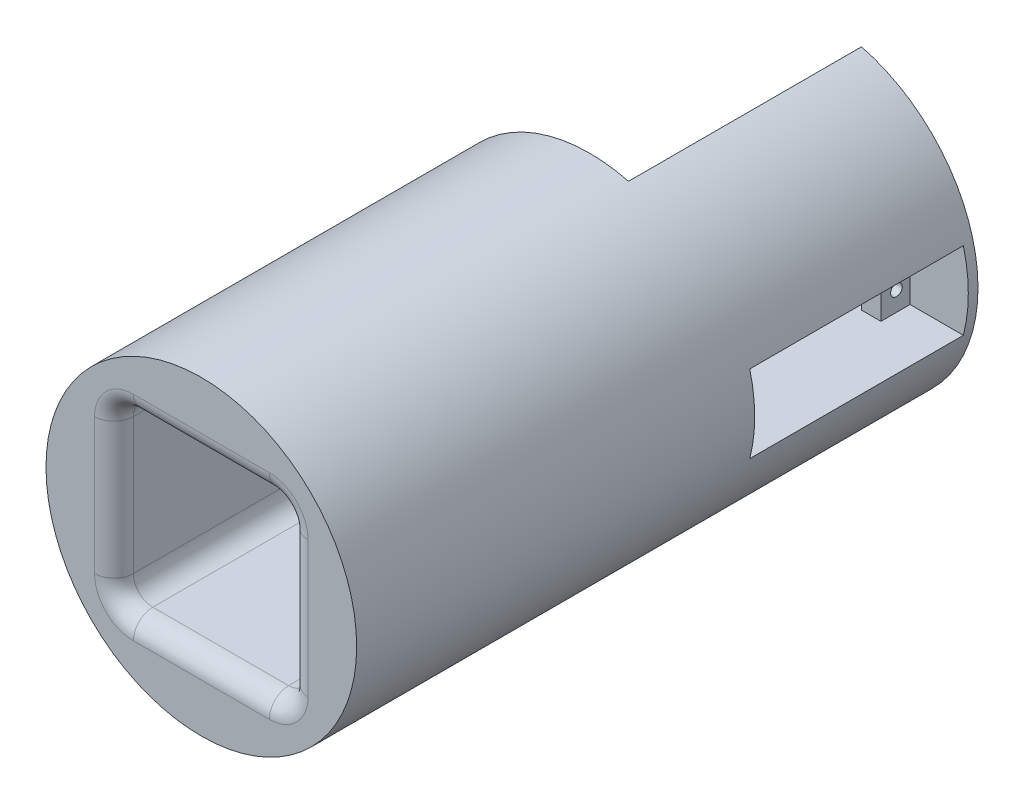
ISO-10303-21;
HEADER;
FILE_DESCRIPTION(('STEP AP214'),'2;1');
FILE_NAME('part.step','',(''),(''),'','','');
FILE_SCHEMA(('AUTOMOTIVE_DESIGN { 1 0 10303 214 1 1 1 1 }'));
ENDSEC;
DATA;
#1=APPLICATION_CONTEXT('core data for automotive mechanical design processes');
#2=APPLICATION_PROTOCOL_DEFINITION('international standard','automotive_design',2000,#1);
#3=PRODUCT_CONTEXT('',#1,'mechanical');
#4=PRODUCT('Part','Part','',(#3));
#5=PRODUCT_RELATED_PRODUCT_CATEGORY('part','',(#4));
#6=PRODUCT_DEFINITION_FORMATION('','',#4);
#7=PRODUCT_DEFINITION_CONTEXT('part definition',#1,'design');
#8=PRODUCT_DEFINITION('design','',#6,#7);
#9=PRODUCT_DEFINITION_SHAPE('','',#8);
#10=(LENGTH_UNIT() NAMED_UNIT(*) SI_UNIT(.MILLI.,.METRE.));
#11=(NAMED_UNIT(*) PLANE_ANGLE_UNIT() SI_UNIT($,.RADIAN.));
#12=(NAMED_UNIT(*) SI_UNIT($,.STERADIAN.) SOLID_ANGLE_UNIT());
#13=UNCERTAINTY_MEASURE_WITH_UNIT(LENGTH_MEASURE(1.E-05),#10,'distance_accuracy_value','');
#14=(GEOMETRIC_REPRESENTATION_CONTEXT(3) GLOBAL_UNCERTAINTY_ASSIGNED_CONTEXT((#13)) GLOBAL_UNIT_ASSIGNED_CONTEXT((#10,
#11,#12)) REPRESENTATION_CONTEXT('',''));
#15=CARTESIAN_POINT('',(0.,0.,0.));
#16=DIRECTION('',(0.,0.,1.));
#17=DIRECTION('',(1.,0.,0.));
#18=AXIS2_PLACEMENT_3D('',#15,#16,#17);
#19=CARTESIAN_POINT('',(49.,0.,-50.));
#20=DIRECTION('',(0.,0.,-1.));
#21=DIRECTION('',(-1.,0.,0.));
#22=AXIS2_PLACEMENT_3D('',#19,#20,#21);
#23=PLANE('',#22);
#24=DIRECTION('',(-1.,0.,0.));
#25=VECTOR('',#24,1.);
#26=CARTESIAN_POINT('',(49.,10.,-50.));
#27=LINE('',#26,#25);
#28=CARTESIAN_POINT('',(25.,10.,-50.));
#29=VERTEX_POINT('',#28);
#30=CARTESIAN_POINT('',(20.,10.,-50.));
#31=VERTEX_POINT('',#30);
#32=EDGE_CURVE('E332',#29,#31,#27,.T.);
#33=ORIENTED_EDGE('',*,*,#32,.F.);
#34=DIRECTION('',(0.,-1.,0.));
#35=VECTOR('',#34,1.);
#36=CARTESIAN_POINT('',(25.,0.,-50.));
#37=LINE('',#36,#35);
#38=CARTESIAN_POINT('',(25.,-9.99999999999999,-50.));
#39=VERTEX_POINT('',#38);
#40=EDGE_CURVE('E312',#29,#39,#37,.T.);
#41=ORIENTED_EDGE('',*,*,#40,.T.);
#42=DIRECTION('',(-1.,0.,0.));
#43=VECTOR('',#42,1.);
#44=CARTESIAN_POINT('',(49.,-9.99999999999999,-50.));
#45=LINE('',#44,#43);
#46=CARTESIAN_POINT('',(20.,-9.99999999999999,-50.));
#47=VERTEX_POINT('',#46);
#48=EDGE_CURVE('E333',#39,#47,#45,.T.);
#49=ORIENTED_EDGE('',*,*,#48,.T.);
#50=DIRECTION('',(0.,-1.,0.));
#51=VECTOR('',#50,1.);
#52=CARTESIAN_POINT('',(20.,0.,-50.));
#53=LINE('',#52,#51);
#54=EDGE_CURVE('E327',#31,#47,#53,.T.);
#55=ORIENTED_EDGE('',*,*,#54,.F.);
#56=EDGE_LOOP('',(#33,#41,#49,#55));
#57=FACE_BOUND('',#56,.T.);
#58=ADVANCED_FACE('F91',(#57),#23,.T.);
#59=CARTESIAN_POINT('',(49.,0.,-90.));
#60=DIRECTION('',(0.,0.,-1.));
#61=DIRECTION('',(-1.,0.,0.));
#62=AXIS2_PLACEMENT_3D('',#59,#60,#61);
#63=PLANE('',#62);
#64=DIRECTION('',(0.,-1.,0.));
#65=VECTOR('',#64,1.);
#66=CARTESIAN_POINT('',(25.,0.,-90.));
#67=LINE('',#66,#65);
#68=CARTESIAN_POINT('',(25.,10.,-90.));
#69=VERTEX_POINT('',#68);
#70=CARTESIAN_POINT('',(25.,-9.99999999999999,-90.));
#71=VERTEX_POINT('',#70);
#72=EDGE_CURVE('E278',#69,#71,#67,.T.);
#73=ORIENTED_EDGE('',*,*,#72,.F.);
#74=DIRECTION('',(-1.,0.,0.));
#75=VECTOR('',#74,1.);
#76=CARTESIAN_POINT('',(49.,10.,-90.));
#77=LINE('',#76,#75);
#78=CARTESIAN_POINT('',(20.,10.,-90.));
#79=VERTEX_POINT('',#78);
#80=EDGE_CURVE('E114',#69,#79,#77,.T.);
#81=ORIENTED_EDGE('',*,*,#80,.T.);
#82=DIRECTION('',(0.,-1.,0.));
#83=VECTOR('',#82,1.);
#84=CARTESIAN_POINT('',(20.,0.,-90.));
#85=LINE('',#84,#83);
#86=CARTESIAN_POINT('',(20.,-9.99999999999999,-90.));
#87=VERTEX_POINT('',#86);
#88=EDGE_CURVE('E330',#79,#87,#85,.T.);
#89=ORIENTED_EDGE('',*,*,#88,.T.);
#90=DIRECTION('',(-1.,0.,0.));
#91=VECTOR('',#90,1.);
#92=CARTESIAN_POINT('',(49.,-9.99999999999999,-90.));
#93=LINE('',#92,#91);
#94=EDGE_CURVE('E336',#71,#87,#93,.T.);
#95=ORIENTED_EDGE('',*,*,#94,.F.);
#96=EDGE_LOOP('',(#73,#81,#89,#95));
#97=FACE_BOUND('',#96,.T.);
#98=ADVANCED_FACE('F517',(#97),#63,.F.);
#99=CARTESIAN_POINT('',(20.,0.,0.));
#100=DIRECTION('',(-1.,0.,0.));
#101=DIRECTION('',(0.,0.,1.));
#102=AXIS2_PLACEMENT_3D('',#99,#100,#101);
#103=PLANE('',#102);
#104=CARTESIAN_POINT('',(20.,-4.99999999999999,-46.));
#105=DIRECTION('',(-1.,0.,0.));
#106=DIRECTION('',(0.,0.,1.));
#107=AXIS2_PLACEMENT_3D('',#104,#105,#106);
#108=CIRCLE('',#107,1.49999999999999);
#109=CARTESIAN_POINT('',(20.,-4.99999999999999,-44.5));
#110=VERTEX_POINT('',#109);
#111=EDGE_CURVE('E321',#110,#110,#108,.T.);
#112=ORIENTED_EDGE('',*,*,#111,.F.);
#113=EDGE_LOOP('',(#112));
#114=FACE_BOUND('',#113,.T.);
#115=CARTESIAN_POINT('',(20.,5.00000000000001,-46.));
#116=DIRECTION('',(-1.,0.,0.));
#117=DIRECTION('',(0.,0.,1.));
#118=AXIS2_PLACEMENT_3D('',#115,#116,#117);
#119=CIRCLE('',#118,1.49999999999999);
#120=CARTESIAN_POINT('',(20.,5.00000000000001,-44.5));
#121=VERTEX_POINT('',#120);
#122=EDGE_CURVE('E324',#121,#121,#119,.T.);
#123=ORIENTED_EDGE('',*,*,#122,.F.);
#124=EDGE_LOOP('',(#123));
#125=FACE_BOUND('',#124,.T.);
#126=DIRECTION('',(0.,0.,-1.));
#127=VECTOR('',#126,1.);
#128=CARTESIAN_POINT('',(20.,10.,-97.5));
#129=LINE('',#128,#127);
#130=CARTESIAN_POINT('',(20.,10.,-42.5));
#131=VERTEX_POINT('',#130);
#132=EDGE_CURVE('E352',#131,#31,#129,.T.);
#133=ORIENTED_EDGE('',*,*,#132,.T.);
#134=ORIENTED_EDGE('',*,*,#54,.T.);
#135=DIRECTION('',(0.,0.,1.));
#136=VECTOR('',#135,1.);
#137=CARTESIAN_POINT('',(20.,-9.99999999999999,-97.5));
#138=LINE('',#137,#136);
#139=CARTESIAN_POINT('',(20.,-9.99999999999999,-42.5));
#140=VERTEX_POINT('',#139);
#141=EDGE_CURVE('E343',#47,#140,#138,.T.);
#142=ORIENTED_EDGE('',*,*,#141,.T.);
#143=DIRECTION('',(0.,1.,0.));
#144=VECTOR('',#143,1.);
#145=CARTESIAN_POINT('',(20.,10.,-42.5));
#146=LINE('',#145,#144);
#147=EDGE_CURVE('E348',#140,#131,#146,.T.);
#148=ORIENTED_EDGE('',*,*,#147,.T.);
#149=EDGE_LOOP('',(#133,#134,#142,#148));
#150=FACE_BOUND('',#149,.T.);
#151=ADVANCED_FACE('F537',(#114,#125,#150),#103,.T.);
#152=CARTESIAN_POINT('',(0.,0.,60.));
#153=DIRECTION('',(0.,0.,-1.));
#154=DIRECTION('',(-1.,0.,0.));
#155=AXIS2_PLACEMENT_3D('',#152,#153,#154);
#156=CYLINDRICAL_SURFACE('',#155,40.);
#157=CARTESIAN_POINT('',(0.,0.,-40.));
#158=DIRECTION('',(0.,0.,-1.));
#159=DIRECTION('',(-1.,0.,0.));
#160=AXIS2_PLACEMENT_3D('',#157,#158,#159);
#161=CIRCLE('',#160,40.);
#162=CARTESIAN_POINT('',(10.,-38.7298334620742,-40.));
#163=VERTEX_POINT('',#162);
#164=CARTESIAN_POINT('',(10.,38.7298334620742,-40.));
#165=VERTEX_POINT('',#164);
#166=EDGE_CURVE('E387',#163,#165,#161,.T.);
#167=ORIENTED_EDGE('',*,*,#166,.F.);
#168=DIRECTION('',(0.,0.,1.));
#169=VECTOR('',#168,1.);
#170=CARTESIAN_POINT('',(10.,-38.7298334620742,-100.));
#171=LINE('',#170,#169);
#172=CARTESIAN_POINT('',(10.,-38.7298334620742,-100.));
#173=VERTEX_POINT('',#172);
#174=EDGE_CURVE('E380',#173,#163,#171,.T.);
#175=ORIENTED_EDGE('',*,*,#174,.F.);
#176=CARTESIAN_POINT('',(0.,0.,-100.));
#177=DIRECTION('',(0.,0.,-1.));
#178=DIRECTION('',(-1.,0.,0.));
#179=AXIS2_PLACEMENT_3D('',#176,#177,#178);
#180=CIRCLE('',#179,40.);
#181=CARTESIAN_POINT('',(10.,38.7298334620742,-100.));
#182=VERTEX_POINT('',#181);
#183=EDGE_CURVE('E377',#182,#173,#180,.T.);
#184=ORIENTED_EDGE('',*,*,#183,.F.);
#185=DIRECTION('',(0.,0.,1.));
#186=VECTOR('',#185,1.);
#187=CARTESIAN_POINT('',(10.,38.7298334620742,-100.));
#188=LINE('',#187,#186);
#189=EDGE_CURVE('E385',#182,#165,#188,.T.);
#190=ORIENTED_EDGE('',*,*,#189,.T.);
#191=EDGE_LOOP('',(#167,#175,#184,#190));
#192=FACE_BOUND('',#191,.T.);
#193=CARTESIAN_POINT('',(0.,0.,60.));
#194=DIRECTION('',(0.,0.,1.));
#195=DIRECTION('',(1.,0.,0.));
#196=AXIS2_PLACEMENT_3D('',#193,#194,#195);
#197=CIRCLE('',#196,40.);
#198=CARTESIAN_POINT('',(40.,0.,60.));
#199=VERTEX_POINT('',#198);
#200=EDGE_CURVE('E391',#199,#199,#197,.T.);
#201=ORIENTED_EDGE('',*,*,#200,.F.);
#202=EDGE_LOOP('',(#201));
#203=FACE_BOUND('',#202,.T.);
#204=DIRECTION('',(0.,0.,-1.));
#205=VECTOR('',#204,1.);
#206=CARTESIAN_POINT('',(38.7298334620742,10.,60.));
#207=LINE('',#206,#205);
#208=CARTESIAN_POINT('',(38.7298334620742,10.,-42.5));
#209=VERTEX_POINT('',#208);
#210=CARTESIAN_POINT('',(38.7298334620742,10.,-97.5));
#211=VERTEX_POINT('',#210);
#212=EDGE_CURVE('E457',#209,#211,#207,.T.);
#213=ORIENTED_EDGE('',*,*,#212,.T.);
#214=CARTESIAN_POINT('',(0.,0.,-97.5));
#215=DIRECTION('',(0.,0.,-1.));
#216=DIRECTION('',(-1.,0.,0.));
#217=AXIS2_PLACEMENT_3D('',#214,#215,#216);
#218=CIRCLE('',#217,40.);
#219=CARTESIAN_POINT('',(38.7298334620742,-9.99999999999998,-97.5));
#220=VERTEX_POINT('',#219);
#221=EDGE_CURVE('E12',#211,#220,#218,.T.);
#222=ORIENTED_EDGE('',*,*,#221,.T.);
#223=DIRECTION('',(0.,0.,-1.));
#224=VECTOR('',#223,1.);
#225=CARTESIAN_POINT('',(38.7298334620742,-9.99999999999999,60.));
#226=LINE('',#225,#224);
#227=CARTESIAN_POINT('',(38.7298334620742,-9.99999999999998,-42.5));
#228=VERTEX_POINT('',#227);
#229=EDGE_CURVE('E267',#220,#228,#226,.F.);
#230=ORIENTED_EDGE('',*,*,#229,.T.);
#231=CARTESIAN_POINT('',(0.,0.,-42.5));
#232=DIRECTION('',(0.,0.,1.));
#233=DIRECTION('',(1.,0.,0.));
#234=AXIS2_PLACEMENT_3D('',#231,#232,#233);
#235=CIRCLE('',#234,40.);
#236=EDGE_CURVE('E99',#228,#209,#235,.T.);
#237=ORIENTED_EDGE('',*,*,#236,.T.);
#238=EDGE_LOOP('',(#213,#222,#230,#237));
#239=FACE_BOUND('',#238,.T.);
#240=ADVANCED_FACE('F499',(#192,#203,#239),#156,.T.);
#241=CARTESIAN_POINT('',(0.,0.,60.));
#242=DIRECTION('',(0.,0.,1.));
#243=DIRECTION('',(1.,0.,0.));
#244=AXIS2_PLACEMENT_3D('',#241,#242,#243);
#245=PLANE('',#244);
#246=ORIENTED_EDGE('',*,*,#200,.T.);
#247=EDGE_LOOP('',(#246));
#248=FACE_BOUND('',#247,.T.);
#249=CARTESIAN_POINT('',(-17.5,17.5,60.));
#250=DIRECTION('',(0.,0.,1.));
#251=DIRECTION('',(1.,0.,0.));
#252=AXIS2_PLACEMENT_3D('',#249,#250,#251);
#253=CIRCLE('',#252,10.);
#254=CARTESIAN_POINT('',(-17.5,27.5,60.));
#255=VERTEX_POINT('',#254);
#256=CARTESIAN_POINT('',(-27.5,17.5,60.));
#257=VERTEX_POINT('',#256);
#258=EDGE_CURVE('E420',#255,#257,#253,.T.);
#259=ORIENTED_EDGE('',*,*,#258,.F.);
#260=DIRECTION('',(1.,0.,0.));
#261=VECTOR('',#260,1.);
#262=CARTESIAN_POINT('',(22.5,27.5,60.));
#263=LINE('',#262,#261);
#264=CARTESIAN_POINT('',(17.5,27.5,60.));
#265=VERTEX_POINT('',#264);
#266=EDGE_CURVE('E417',#255,#265,#263,.T.);
#267=ORIENTED_EDGE('',*,*,#266,.T.);
#268=CARTESIAN_POINT('',(17.5,17.5,60.));
#269=DIRECTION('',(0.,0.,1.));
#270=DIRECTION('',(1.,0.,0.));
#271=AXIS2_PLACEMENT_3D('',#268,#269,#270);
#272=CIRCLE('',#271,10.);
#273=CARTESIAN_POINT('',(27.5,17.5,60.));
#274=VERTEX_POINT('',#273);
#275=EDGE_CURVE('E414',#274,#265,#272,.T.);
#276=ORIENTED_EDGE('',*,*,#275,.F.);
#277=DIRECTION('',(0.,-1.,0.));
#278=VECTOR('',#277,1.);
#279=CARTESIAN_POINT('',(27.5,-22.5,60.));
#280=LINE('',#279,#278);
#281=CARTESIAN_POINT('',(27.5,-17.5,60.));
#282=VERTEX_POINT('',#281);
#283=EDGE_CURVE('E412',#274,#282,#280,.T.);
#284=ORIENTED_EDGE('',*,*,#283,.T.);
#285=CARTESIAN_POINT('',(17.5,-17.5,60.));
#286=DIRECTION('',(0.,0.,1.));
#287=DIRECTION('',(1.,0.,0.));
#288=AXIS2_PLACEMENT_3D('',#285,#286,#287);
#289=CIRCLE('',#288,10.);
#290=CARTESIAN_POINT('',(17.5,-27.5,60.));
#291=VERTEX_POINT('',#290);
#292=EDGE_CURVE('E409',#291,#282,#289,.T.);
#293=ORIENTED_EDGE('',*,*,#292,.F.);
#294=DIRECTION('',(1.,0.,0.));
#295=VECTOR('',#294,1.);
#296=CARTESIAN_POINT('',(0.,-27.5,60.));
#297=LINE('',#296,#295);
#298=CARTESIAN_POINT('',(-17.5,-27.5,60.));
#299=VERTEX_POINT('',#298);
#300=EDGE_CURVE('E405',#291,#299,#297,.F.);
#301=ORIENTED_EDGE('',*,*,#300,.T.);
#302=CARTESIAN_POINT('',(-17.5,-17.5,60.));
#303=DIRECTION('',(0.,0.,1.));
#304=DIRECTION('',(1.,0.,0.));
#305=AXIS2_PLACEMENT_3D('',#302,#303,#304);
#306=CIRCLE('',#305,10.);
#307=CARTESIAN_POINT('',(-27.5,-17.5,60.));
#308=VERTEX_POINT('',#307);
#309=EDGE_CURVE('E394',#308,#299,#306,.T.);
#310=ORIENTED_EDGE('',*,*,#309,.F.);
#311=DIRECTION('',(0.,-1.,0.));
#312=VECTOR('',#311,1.);
#313=CARTESIAN_POINT('',(-27.5,0.,60.));
#314=LINE('',#313,#312);
#315=EDGE_CURVE('E407',#308,#257,#314,.F.);
#316=ORIENTED_EDGE('',*,*,#315,.T.);
#317=EDGE_LOOP('',(#259,#267,#276,#284,#293,#301,#310,#316));
#318=FACE_BOUND('',#317,.T.);
#319=ADVANCED_FACE('F546',(#248,#318),#245,.T.);
#320=CARTESIAN_POINT('',(0.,0.,-40.));
#321=DIRECTION('',(0.,0.,-1.));
#322=DIRECTION('',(-1.,0.,0.));
#323=AXIS2_PLACEMENT_3D('',#320,#321,#322);
#324=PLANE('',#323);
#325=ORIENTED_EDGE('',*,*,#166,.T.);
#326=DIRECTION('',(0.,-1.,0.));
#327=VECTOR('',#326,1.);
#328=CARTESIAN_POINT('',(10.,0.,-40.));
#329=LINE('',#328,#327);
#330=EDGE_CURVE('E378',#165,#163,#329,.T.);
#331=ORIENTED_EDGE('',*,*,#330,.T.);
#332=EDGE_LOOP('',(#325,#331));
#333=FACE_BOUND('',#332,.T.);
#334=ADVANCED_FACE('F815',(#333),#324,.T.);
#335=CARTESIAN_POINT('',(0.,22.5,60.));
#336=DIRECTION('',(0.,1.,0.));
#337=DIRECTION('',(0.,0.,1.));
#338=AXIS2_PLACEMENT_3D('',#335,#336,#337);
#339=PLANE('',#338);
#340=DIRECTION('',(1.,0.,0.));
#341=VECTOR('',#340,1.);
#342=CARTESIAN_POINT('',(-22.5,22.5,55.));
#343=LINE('',#342,#341);
#344=CARTESIAN_POINT('',(17.5,22.5,55.));
#345=VERTEX_POINT('',#344);
#346=CARTESIAN_POINT('',(-17.5,22.5,55.));
#347=VERTEX_POINT('',#346);
#348=EDGE_CURVE('E425',#345,#347,#343,.F.);
#349=ORIENTED_EDGE('',*,*,#348,.T.);
#350=DIRECTION('',(0.,0.,-1.));
#351=VECTOR('',#350,1.);
#352=CARTESIAN_POINT('',(-17.5,22.5,60.));
#353=LINE('',#352,#351);
#354=CARTESIAN_POINT('',(-17.5,22.5,0.));
#355=VERTEX_POINT('',#354);
#356=EDGE_CURVE('E428',#347,#355,#353,.T.);
#357=ORIENTED_EDGE('',*,*,#356,.T.);
#358=DIRECTION('',(1.,0.,0.));
#359=VECTOR('',#358,1.);
#360=CARTESIAN_POINT('',(0.,22.5,0.));
#361=LINE('',#360,#359);
#362=CARTESIAN_POINT('',(17.5,22.5,0.));
#363=VERTEX_POINT('',#362);
#364=EDGE_CURVE('E390',#355,#363,#361,.T.);
#365=ORIENTED_EDGE('',*,*,#364,.T.);
#366=DIRECTION('',(0.,0.,-1.));
#367=VECTOR('',#366,1.);
#368=CARTESIAN_POINT('',(17.5,22.5,60.));
#369=LINE('',#368,#367);
#370=EDGE_CURVE('E423',#363,#345,#369,.F.);
#371=ORIENTED_EDGE('',*,*,#370,.T.);
#372=EDGE_LOOP('',(#349,#357,#365,#371));
#373=FACE_BOUND('',#372,.T.);
#374=ADVANCED_FACE('F842',(#373),#339,.F.);
#375=CARTESIAN_POINT('',(22.5,0.,60.));
#376=DIRECTION('',(1.,0.,0.));
#377=DIRECTION('',(0.,1.,0.));
#378=AXIS2_PLACEMENT_3D('',#375,#376,#377);
#379=PLANE('',#378);
#380=DIRECTION('',(0.,-1.,0.));
#381=VECTOR('',#380,1.);
#382=CARTESIAN_POINT('',(22.5,0.,0.));
#383=LINE('',#382,#381);
#384=CARTESIAN_POINT('',(22.5,17.5,0.));
#385=VERTEX_POINT('',#384);
#386=CARTESIAN_POINT('',(22.5,-17.5,0.));
#387=VERTEX_POINT('',#386);
#388=EDGE_CURVE('E398',#385,#387,#383,.T.);
#389=ORIENTED_EDGE('',*,*,#388,.T.);
#390=DIRECTION('',(0.,0.,-1.));
#391=VECTOR('',#390,1.);
#392=CARTESIAN_POINT('',(22.5,-17.5,60.));
#393=LINE('',#392,#391);
#394=CARTESIAN_POINT('',(22.5,-17.5,55.));
#395=VERTEX_POINT('',#394);
#396=EDGE_CURVE('E434',#387,#395,#393,.F.);
#397=ORIENTED_EDGE('',*,*,#396,.T.);
#398=DIRECTION('',(0.,-1.,0.));
#399=VECTOR('',#398,1.);
#400=CARTESIAN_POINT('',(22.5,22.5,55.));
#401=LINE('',#400,#399);
#402=CARTESIAN_POINT('',(22.5,17.5,55.));
#403=VERTEX_POINT('',#402);
#404=EDGE_CURVE('E432',#395,#403,#401,.F.);
#405=ORIENTED_EDGE('',*,*,#404,.T.);
#406=DIRECTION('',(0.,0.,-1.));
#407=VECTOR('',#406,1.);
#408=CARTESIAN_POINT('',(22.5,17.5,0.));
#409=LINE('',#408,#407);
#410=EDGE_CURVE('E430',#403,#385,#409,.T.);
#411=ORIENTED_EDGE('',*,*,#410,.T.);
#412=EDGE_LOOP('',(#389,#397,#405,#411));
#413=FACE_BOUND('',#412,.T.);
#414=ADVANCED_FACE('F870',(#413),#379,.F.);
#415=CARTESIAN_POINT('',(0.,-22.5,60.));
#416=DIRECTION('',(0.,1.,0.));
#417=DIRECTION('',(0.,0.,1.));
#418=AXIS2_PLACEMENT_3D('',#415,#416,#417);
#419=PLANE('',#418);
#420=DIRECTION('',(1.,0.,0.));
#421=VECTOR('',#420,1.);
#422=CARTESIAN_POINT('',(0.,-22.5,55.));
#423=LINE('',#422,#421);
#424=CARTESIAN_POINT('',(-17.5,-22.5,55.));
#425=VERTEX_POINT('',#424);
#426=CARTESIAN_POINT('',(17.5,-22.5,55.));
#427=VERTEX_POINT('',#426);
#428=EDGE_CURVE('E446',#425,#427,#423,.T.);
#429=ORIENTED_EDGE('',*,*,#428,.T.);
#430=DIRECTION('',(0.,0.,-1.));
#431=VECTOR('',#430,1.);
#432=CARTESIAN_POINT('',(17.5,-22.5,60.));
#433=LINE('',#432,#431);
#434=CARTESIAN_POINT('',(17.5,-22.5,5.));
#435=VERTEX_POINT('',#434);
#436=EDGE_CURVE('E448',#427,#435,#433,.T.);
#437=ORIENTED_EDGE('',*,*,#436,.T.);
#438=DIRECTION('',(1.,0.,0.));
#439=VECTOR('',#438,1.);
#440=CARTESIAN_POINT('',(0.,-22.5,5.));
#441=LINE('',#440,#439);
#442=CARTESIAN_POINT('',(-17.5,-22.5,5.));
#443=VERTEX_POINT('',#442);
#444=EDGE_CURVE('E442',#435,#443,#441,.F.);
#445=ORIENTED_EDGE('',*,*,#444,.T.);
#446=DIRECTION('',(0.,0.,-1.));
#447=VECTOR('',#446,1.);
#448=CARTESIAN_POINT('',(-17.5,-22.5,60.));
#449=LINE('',#448,#447);
#450=EDGE_CURVE('E444',#443,#425,#449,.F.);
#451=ORIENTED_EDGE('',*,*,#450,.T.);
#452=EDGE_LOOP('',(#429,#437,#445,#451));
#453=FACE_BOUND('',#452,.T.);
#454=ADVANCED_FACE('F861',(#453),#419,.T.);
#455=CARTESIAN_POINT('',(-22.5,0.,60.));
#456=DIRECTION('',(1.,0.,0.));
#457=DIRECTION('',(0.,1.,0.));
#458=AXIS2_PLACEMENT_3D('',#455,#456,#457);
#459=PLANE('',#458);
#460=DIRECTION('',(0.,-1.,0.));
#461=VECTOR('',#460,1.);
#462=CARTESIAN_POINT('',(-22.5,0.,55.));
#463=LINE('',#462,#461);
#464=CARTESIAN_POINT('',(-22.5,17.5,55.));
#465=VERTEX_POINT('',#464);
#466=CARTESIAN_POINT('',(-22.5,-17.5,55.));
#467=VERTEX_POINT('',#466);
#468=EDGE_CURVE('E438',#465,#467,#463,.T.);
#469=ORIENTED_EDGE('',*,*,#468,.T.);
#470=DIRECTION('',(0.,0.,-1.));
#471=VECTOR('',#470,1.);
#472=CARTESIAN_POINT('',(-22.5,-17.5,0.));
#473=LINE('',#472,#471);
#474=CARTESIAN_POINT('',(-22.5,-17.5,0.));
#475=VERTEX_POINT('',#474);
#476=EDGE_CURVE('E440',#467,#475,#473,.T.);
#477=ORIENTED_EDGE('',*,*,#476,.T.);
#478=DIRECTION('',(0.,-1.,0.));
#479=VECTOR('',#478,1.);
#480=CARTESIAN_POINT('',(-22.5,0.,0.));
#481=LINE('',#480,#479);
#482=CARTESIAN_POINT('',(-22.5,17.5,0.));
#483=VERTEX_POINT('',#482);
#484=EDGE_CURVE('E395',#483,#475,#481,.T.);
#485=ORIENTED_EDGE('',*,*,#484,.F.);
#486=DIRECTION('',(0.,0.,-1.));
#487=VECTOR('',#486,1.);
#488=CARTESIAN_POINT('',(-22.5,17.5,60.));
#489=LINE('',#488,#487);
#490=EDGE_CURVE('E436',#483,#465,#489,.F.);
#491=ORIENTED_EDGE('',*,*,#490,.T.);
#492=EDGE_LOOP('',(#469,#477,#485,#491));
#493=FACE_BOUND('',#492,.T.);
#494=ADVANCED_FACE('F852',(#493),#459,.T.);
#495=CARTESIAN_POINT('',(0.,0.,0.));
#496=DIRECTION('',(0.,0.,-1.));
#497=DIRECTION('',(-1.,0.,0.));
#498=AXIS2_PLACEMENT_3D('',#495,#496,#497);
#499=PLANE('',#498);
#500=ORIENTED_EDGE('',*,*,#484,.T.);
#501=DIRECTION('',(1.,0.,0.));
#502=VECTOR('',#501,1.);
#503=CARTESIAN_POINT('',(0.,-17.5,0.));
#504=LINE('',#503,#502);
#505=EDGE_CURVE('E455',#475,#387,#504,.T.);
#506=ORIENTED_EDGE('',*,*,#505,.T.);
#507=ORIENTED_EDGE('',*,*,#388,.F.);
#508=CARTESIAN_POINT('',(17.5,17.5,0.));
#509=DIRECTION('',(0.,0.,-1.));
#510=DIRECTION('',(-1.,0.,0.));
#511=AXIS2_PLACEMENT_3D('',#508,#509,#510);
#512=CIRCLE('',#511,5.);
#513=EDGE_CURVE('E451',#385,#363,#512,.F.);
#514=ORIENTED_EDGE('',*,*,#513,.T.);
#515=ORIENTED_EDGE('',*,*,#364,.F.);
#516=CARTESIAN_POINT('',(-17.5,17.5,0.));
#517=DIRECTION('',(0.,0.,-1.));
#518=DIRECTION('',(-1.,0.,0.));
#519=AXIS2_PLACEMENT_3D('',#516,#517,#518);
#520=CIRCLE('',#519,5.);
#521=EDGE_CURVE('E453',#355,#483,#520,.F.);
#522=ORIENTED_EDGE('',*,*,#521,.T.);
#523=EDGE_LOOP('',(#500,#506,#507,#514,#515,#522));
#524=FACE_BOUND('',#523,.T.);
#525=ADVANCED_FACE('F834',(#524),#499,.F.);
#526=CARTESIAN_POINT('',(10.,0.,-100.));
#527=DIRECTION('',(-1.,0.,0.));
#528=DIRECTION('',(0.,0.,1.));
#529=AXIS2_PLACEMENT_3D('',#526,#527,#528);
#530=PLANE('',#529);
#531=DIRECTION('',(0.,-1.,0.));
#532=VECTOR('',#531,1.);
#533=CARTESIAN_POINT('',(10.,10.,-97.5));
#534=LINE('',#533,#532);
#535=CARTESIAN_POINT('',(10.,10.,-97.5));
#536=VERTEX_POINT('',#535);
#537=CARTESIAN_POINT('',(10.,-9.99999999999999,-97.5));
#538=VERTEX_POINT('',#537);
#539=EDGE_CURVE('E335',#536,#538,#534,.T.);
#540=ORIENTED_EDGE('',*,*,#539,.F.);
#541=DIRECTION('',(0.,0.,-1.));
#542=VECTOR('',#541,1.);
#543=CARTESIAN_POINT('',(10.,10.,-97.5));
#544=LINE('',#543,#542);
#545=CARTESIAN_POINT('',(10.,10.,-42.5));
#546=VERTEX_POINT('',#545);
#547=EDGE_CURVE('E344',#546,#536,#544,.T.);
#548=ORIENTED_EDGE('',*,*,#547,.F.);
#549=DIRECTION('',(0.,1.,0.));
#550=VECTOR('',#549,1.);
#551=CARTESIAN_POINT('',(10.,10.,-42.5));
#552=LINE('',#551,#550);
#553=CARTESIAN_POINT('',(10.,-9.99999999999999,-42.5));
#554=VERTEX_POINT('',#553);
#555=EDGE_CURVE('E360',#554,#546,#552,.T.);
#556=ORIENTED_EDGE('',*,*,#555,.F.);
#557=DIRECTION('',(0.,0.,1.));
#558=VECTOR('',#557,1.);
#559=CARTESIAN_POINT('',(10.,-9.99999999999999,-97.5));
#560=LINE('',#559,#558);
#561=EDGE_CURVE('E357',#538,#554,#560,.T.);
#562=ORIENTED_EDGE('',*,*,#561,.F.);
#563=EDGE_LOOP('',(#540,#548,#556,#562));
#564=FACE_BOUND('',#563,.T.);
#565=ORIENTED_EDGE('',*,*,#330,.F.);
#566=ORIENTED_EDGE('',*,*,#189,.F.);
#567=DIRECTION('',(0.,-1.,0.));
#568=VECTOR('',#567,1.);
#569=CARTESIAN_POINT('',(10.,0.,-100.));
#570=LINE('',#569,#568);
#571=EDGE_CURVE('E374',#182,#173,#570,.T.);
#572=ORIENTED_EDGE('',*,*,#571,.T.);
#573=ORIENTED_EDGE('',*,*,#174,.T.);
#574=EDGE_LOOP('',(#565,#566,#572,#573));
#575=FACE_BOUND('',#574,.T.);
#576=ADVANCED_FACE('F529',(#564,#575),#530,.T.);
#577=CARTESIAN_POINT('',(0.,0.,-100.));
#578=DIRECTION('',(0.,0.,-1.));
#579=DIRECTION('',(-1.,0.,0.));
#580=AXIS2_PLACEMENT_3D('',#577,#578,#579);
#581=PLANE('',#580);
#582=ORIENTED_EDGE('',*,*,#571,.F.);
#583=ORIENTED_EDGE('',*,*,#183,.T.);
#584=EDGE_LOOP('',(#582,#583));
#585=FACE_BOUND('',#584,.T.);
#586=ADVANCED_FACE('F807',(#585),#581,.T.);
#587=CARTESIAN_POINT('',(0.,-17.5,5.));
#588=DIRECTION('',(1.,0.,0.));
#589=DIRECTION('',(0.,0.,-1.));
#590=AXIS2_PLACEMENT_3D('',#587,#588,#589);
#591=CYLINDRICAL_SURFACE('',#590,5.);
#592=CARTESIAN_POINT('',(17.5,-17.5,5.));
#593=DIRECTION('',(-0.707106781186547,0.,-0.707106781186547));
#594=DIRECTION('',(0.707106781186547,0.,-0.707106781186547));
#595=AXIS2_PLACEMENT_3D('',#592,#593,#594);
#596=ELLIPSE('',#595,7.07106781186547,5.);
#597=EDGE_CURVE('E491',#387,#435,#596,.T.);
#598=ORIENTED_EDGE('',*,*,#597,.F.);
#599=ORIENTED_EDGE('',*,*,#505,.F.);
#600=CARTESIAN_POINT('',(-17.5,-17.5,5.));
#601=DIRECTION('',(-0.707106781186547,0.,0.707106781186547));
#602=DIRECTION('',(0.707106781186547,0.,0.707106781186547));
#603=AXIS2_PLACEMENT_3D('',#600,#601,#602);
#604=ELLIPSE('',#603,7.07106781186547,5.);
#605=EDGE_CURVE('E383',#443,#475,#604,.F.);
#606=ORIENTED_EDGE('',*,*,#605,.F.);
#607=ORIENTED_EDGE('',*,*,#444,.F.);
#608=EDGE_LOOP('',(#598,#599,#606,#607));
#609=FACE_BOUND('',#608,.T.);
#610=ADVANCED_FACE('F93',(#609),#591,.F.);
#611=CARTESIAN_POINT('',(-17.5,-17.5,60.));
#612=DIRECTION('',(0.,0.,1.));
#613=DIRECTION('',(1.,0.,0.));
#614=AXIS2_PLACEMENT_3D('',#611,#612,#613);
#615=CYLINDRICAL_SURFACE('',#614,5.);
#616=ORIENTED_EDGE('',*,*,#605,.T.);
#617=ORIENTED_EDGE('',*,*,#476,.F.);
#618=CARTESIAN_POINT('',(-17.5,-17.5,55.));
#619=DIRECTION('',(0.,0.,1.));
#620=DIRECTION('',(1.,0.,0.));
#621=AXIS2_PLACEMENT_3D('',#618,#619,#620);
#622=CIRCLE('',#621,5.);
#623=EDGE_CURVE('E488',#425,#467,#622,.F.);
#624=ORIENTED_EDGE('',*,*,#623,.F.);
#625=ORIENTED_EDGE('',*,*,#450,.F.);
#626=EDGE_LOOP('',(#616,#617,#624,#625));
#627=FACE_BOUND('',#626,.T.);
#628=ADVANCED_FACE('F791',(#627),#615,.F.);
#629=CARTESIAN_POINT('',(0.,-27.5,55.));
#630=DIRECTION('',(1.,0.,0.));
#631=DIRECTION('',(0.,0.,-1.));
#632=AXIS2_PLACEMENT_3D('',#629,#630,#631);
#633=CYLINDRICAL_SURFACE('',#632,5.);
#634=CARTESIAN_POINT('',(17.5,-27.5,55.));
#635=DIRECTION('',(1.,0.,0.));
#636=DIRECTION('',(0.,0.,-1.));
#637=AXIS2_PLACEMENT_3D('',#634,#635,#636);
#638=CIRCLE('',#637,5.);
#639=EDGE_CURVE('E482',#427,#291,#638,.T.);
#640=ORIENTED_EDGE('',*,*,#639,.F.);
#641=ORIENTED_EDGE('',*,*,#428,.F.);
#642=CARTESIAN_POINT('',(-17.5,-27.5,55.));
#643=DIRECTION('',(-1.,0.,0.));
#644=DIRECTION('',(0.,0.,1.));
#645=AXIS2_PLACEMENT_3D('',#642,#643,#644);
#646=CIRCLE('',#645,5.);
#647=EDGE_CURVE('E485',#299,#425,#646,.T.);
#648=ORIENTED_EDGE('',*,*,#647,.F.);
#649=ORIENTED_EDGE('',*,*,#300,.F.);
#650=EDGE_LOOP('',(#640,#641,#648,#649));
#651=FACE_BOUND('',#650,.T.);
#652=ADVANCED_FACE('F782',(#651),#633,.T.);
#653=CARTESIAN_POINT('',(17.5,-17.5,60.));
#654=DIRECTION('',(0.,0.,-1.));
#655=DIRECTION('',(-1.,0.,0.));
#656=AXIS2_PLACEMENT_3D('',#653,#654,#655);
#657=CYLINDRICAL_SURFACE('',#656,5.);
#658=ORIENTED_EDGE('',*,*,#597,.T.);
#659=ORIENTED_EDGE('',*,*,#436,.F.);
#660=CARTESIAN_POINT('',(17.5,-17.5,55.));
#661=DIRECTION('',(0.,0.,1.));
#662=DIRECTION('',(1.,0.,0.));
#663=AXIS2_PLACEMENT_3D('',#660,#661,#662);
#664=CIRCLE('',#663,5.);
#665=EDGE_CURVE('E479',#395,#427,#664,.F.);
#666=ORIENTED_EDGE('',*,*,#665,.F.);
#667=ORIENTED_EDGE('',*,*,#396,.F.);
#668=EDGE_LOOP('',(#658,#659,#666,#667));
#669=FACE_BOUND('',#668,.T.);
#670=ADVANCED_FACE('F773',(#669),#657,.F.);
#671=CARTESIAN_POINT('',(-17.5,-17.5,55.));
#672=DIRECTION('',(0.,0.,1.));
#673=DIRECTION('',(1.,0.,0.));
#674=AXIS2_PLACEMENT_3D('',#671,#672,#673);
#675=TOROIDAL_SURFACE('',#674,10.,5.);
#676=ORIENTED_EDGE('',*,*,#647,.T.);
#677=ORIENTED_EDGE('',*,*,#623,.T.);
#678=CARTESIAN_POINT('',(-27.5,-17.5,55.));
#679=DIRECTION('',(0.,-1.,0.));
#680=DIRECTION('',(0.,0.,-1.));
#681=AXIS2_PLACEMENT_3D('',#678,#679,#680);
#682=CIRCLE('',#681,5.);
#683=EDGE_CURVE('E476',#308,#467,#682,.F.);
#684=ORIENTED_EDGE('',*,*,#683,.F.);
#685=ORIENTED_EDGE('',*,*,#309,.T.);
#686=EDGE_LOOP('',(#676,#677,#684,#685));
#687=FACE_BOUND('',#686,.T.);
#688=ADVANCED_FACE('F764',(#687),#675,.T.);
#689=CARTESIAN_POINT('',(17.5,-17.5,55.));
#690=DIRECTION('',(0.,0.,1.));
#691=DIRECTION('',(1.,0.,0.));
#692=AXIS2_PLACEMENT_3D('',#689,#690,#691);
#693=TOROIDAL_SURFACE('',#692,10.,5.);
#694=ORIENTED_EDGE('',*,*,#639,.T.);
#695=ORIENTED_EDGE('',*,*,#292,.T.);
#696=CARTESIAN_POINT('',(27.5,-17.5,55.));
#697=DIRECTION('',(0.,-1.,0.));
#698=DIRECTION('',(0.,0.,-1.));
#699=AXIS2_PLACEMENT_3D('',#696,#697,#698);
#700=CIRCLE('',#699,5.);
#701=EDGE_CURVE('E473',#395,#282,#700,.F.);
#702=ORIENTED_EDGE('',*,*,#701,.F.);
#703=ORIENTED_EDGE('',*,*,#665,.T.);
#704=EDGE_LOOP('',(#694,#695,#702,#703));
#705=FACE_BOUND('',#704,.T.);
#706=ADVANCED_FACE('F754',(#705),#693,.T.);
#707=CARTESIAN_POINT('',(-17.5,17.5,60.));
#708=DIRECTION('',(0.,0.,-1.));
#709=DIRECTION('',(-1.,0.,0.));
#710=AXIS2_PLACEMENT_3D('',#707,#708,#709);
#711=CYLINDRICAL_SURFACE('',#710,5.);
#712=ORIENTED_EDGE('',*,*,#521,.F.);
#713=ORIENTED_EDGE('',*,*,#356,.F.);
#714=CARTESIAN_POINT('',(-17.5,17.5,55.));
#715=DIRECTION('',(0.,0.,1.));
#716=DIRECTION('',(1.,0.,0.));
#717=AXIS2_PLACEMENT_3D('',#714,#715,#716);
#718=CIRCLE('',#717,5.);
#719=EDGE_CURVE('E470',#465,#347,#718,.F.);
#720=ORIENTED_EDGE('',*,*,#719,.F.);
#721=ORIENTED_EDGE('',*,*,#490,.F.);
#722=EDGE_LOOP('',(#712,#713,#720,#721));
#723=FACE_BOUND('',#722,.T.);
#724=ADVANCED_FACE('F745',(#723),#711,.F.);
#725=CARTESIAN_POINT('',(-27.5,0.,55.));
#726=DIRECTION('',(0.,-1.,0.));
#727=DIRECTION('',(1.,0.,0.));
#728=AXIS2_PLACEMENT_3D('',#725,#726,#727);
#729=CYLINDRICAL_SURFACE('',#728,5.);
#730=ORIENTED_EDGE('',*,*,#683,.T.);
#731=ORIENTED_EDGE('',*,*,#468,.F.);
#732=CARTESIAN_POINT('',(-27.5,17.5,55.));
#733=DIRECTION('',(0.,1.,0.));
#734=DIRECTION('',(0.,0.,1.));
#735=AXIS2_PLACEMENT_3D('',#732,#733,#734);
#736=CIRCLE('',#735,5.);
#737=EDGE_CURVE('E467',#257,#465,#736,.T.);
#738=ORIENTED_EDGE('',*,*,#737,.F.);
#739=ORIENTED_EDGE('',*,*,#315,.F.);
#740=EDGE_LOOP('',(#730,#731,#738,#739));
#741=FACE_BOUND('',#740,.T.);
#742=ADVANCED_FACE('F736',(#741),#729,.T.);
#743=CARTESIAN_POINT('',(27.5,0.,55.));
#744=DIRECTION('',(0.,1.,0.));
#745=DIRECTION('',(-1.,0.,0.));
#746=AXIS2_PLACEMENT_3D('',#743,#744,#745);
#747=CYLINDRICAL_SURFACE('',#746,5.);
#748=ORIENTED_EDGE('',*,*,#701,.T.);
#749=ORIENTED_EDGE('',*,*,#283,.F.);
#750=CARTESIAN_POINT('',(27.5,17.5,55.));
#751=DIRECTION('',(0.,1.,0.));
#752=DIRECTION('',(0.,0.,1.));
#753=AXIS2_PLACEMENT_3D('',#750,#751,#752);
#754=CIRCLE('',#753,5.);
#755=EDGE_CURVE('E464',#403,#274,#754,.T.);
#756=ORIENTED_EDGE('',*,*,#755,.F.);
#757=ORIENTED_EDGE('',*,*,#404,.F.);
#758=EDGE_LOOP('',(#748,#749,#756,#757));
#759=FACE_BOUND('',#758,.T.);
#760=ADVANCED_FACE('F726',(#759),#747,.T.);
#761=CARTESIAN_POINT('',(17.5,17.5,60.));
#762=DIRECTION('',(0.,0.,1.));
#763=DIRECTION('',(1.,0.,0.));
#764=AXIS2_PLACEMENT_3D('',#761,#762,#763);
#765=CYLINDRICAL_SURFACE('',#764,5.);
#766=ORIENTED_EDGE('',*,*,#513,.F.);
#767=ORIENTED_EDGE('',*,*,#410,.F.);
#768=CARTESIAN_POINT('',(17.5,17.5,55.));
#769=DIRECTION('',(0.,0.,1.));
#770=DIRECTION('',(1.,0.,0.));
#771=AXIS2_PLACEMENT_3D('',#768,#769,#770);
#772=CIRCLE('',#771,5.);
#773=EDGE_CURVE('E461',#345,#403,#772,.F.);
#774=ORIENTED_EDGE('',*,*,#773,.F.);
#775=ORIENTED_EDGE('',*,*,#370,.F.);
#776=EDGE_LOOP('',(#766,#767,#774,#775));
#777=FACE_BOUND('',#776,.T.);
#778=ADVANCED_FACE('F716',(#777),#765,.F.);
#779=CARTESIAN_POINT('',(-17.5,17.5,55.));
#780=DIRECTION('',(0.,0.,1.));
#781=DIRECTION('',(1.,0.,0.));
#782=AXIS2_PLACEMENT_3D('',#779,#780,#781);
#783=TOROIDAL_SURFACE('',#782,10.,5.);
#784=ORIENTED_EDGE('',*,*,#737,.T.);
#785=ORIENTED_EDGE('',*,*,#719,.T.);
#786=CARTESIAN_POINT('',(-17.5,27.5,55.));
#787=DIRECTION('',(-1.,0.,0.));
#788=DIRECTION('',(0.,0.,1.));
#789=AXIS2_PLACEMENT_3D('',#786,#787,#788);
#790=CIRCLE('',#789,5.);
#791=EDGE_CURVE('E459',#255,#347,#790,.F.);
#792=ORIENTED_EDGE('',*,*,#791,.F.);
#793=ORIENTED_EDGE('',*,*,#258,.T.);
#794=EDGE_LOOP('',(#784,#785,#792,#793));
#795=FACE_BOUND('',#794,.T.);
#796=ADVANCED_FACE('F707',(#795),#783,.T.);
#797=CARTESIAN_POINT('',(17.5,17.5,55.));
#798=DIRECTION('',(0.,0.,1.));
#799=DIRECTION('',(1.,0.,0.));
#800=AXIS2_PLACEMENT_3D('',#797,#798,#799);
#801=TOROIDAL_SURFACE('',#800,10.,5.);
#802=ORIENTED_EDGE('',*,*,#755,.T.);
#803=ORIENTED_EDGE('',*,*,#275,.T.);
#804=CARTESIAN_POINT('',(17.5,27.5,55.));
#805=DIRECTION('',(1.,0.,0.));
#806=DIRECTION('',(0.,0.,-1.));
#807=AXIS2_PLACEMENT_3D('',#804,#805,#806);
#808=CIRCLE('',#807,5.);
#809=EDGE_CURVE('E367',#345,#265,#808,.F.);
#810=ORIENTED_EDGE('',*,*,#809,.F.);
#811=ORIENTED_EDGE('',*,*,#773,.T.);
#812=EDGE_LOOP('',(#802,#803,#810,#811));
#813=FACE_BOUND('',#812,.T.);
#814=ADVANCED_FACE('F696',(#813),#801,.T.);
#815=CARTESIAN_POINT('',(0.,27.5,55.));
#816=DIRECTION('',(-1.,0.,0.));
#817=DIRECTION('',(0.,0.,1.));
#818=AXIS2_PLACEMENT_3D('',#815,#816,#817);
#819=CYLINDRICAL_SURFACE('',#818,5.);
#820=ORIENTED_EDGE('',*,*,#791,.T.);
#821=ORIENTED_EDGE('',*,*,#348,.F.);
#822=ORIENTED_EDGE('',*,*,#809,.T.);
#823=ORIENTED_EDGE('',*,*,#266,.F.);
#824=EDGE_LOOP('',(#820,#821,#822,#823));
#825=FACE_BOUND('',#824,.T.);
#826=ADVANCED_FACE('F687',(#825),#819,.T.);
#827=CARTESIAN_POINT('',(20.,10.,-97.5));
#828=DIRECTION('',(0.,0.,-1.));
#829=DIRECTION('',(-1.,0.,0.));
#830=AXIS2_PLACEMENT_3D('',#827,#828,#829);
#831=PLANE('',#830);
#832=ORIENTED_EDGE('',*,*,#539,.T.);
#833=DIRECTION('',(-1.,0.,0.));
#834=VECTOR('',#833,1.);
#835=CARTESIAN_POINT('',(20.,-9.99999999999999,-97.5));
#836=LINE('',#835,#834);
#837=CARTESIAN_POINT('',(20.,-9.99999999999999,-97.5));
#838=VERTEX_POINT('',#837);
#839=EDGE_CURVE('E355',#838,#538,#836,.T.);
#840=ORIENTED_EDGE('',*,*,#839,.F.);
#841=DIRECTION('',(0.,-1.,0.));
#842=VECTOR('',#841,1.);
#843=CARTESIAN_POINT('',(20.,10.,-97.5));
#844=LINE('',#843,#842);
#845=CARTESIAN_POINT('',(20.,10.,-97.5));
#846=VERTEX_POINT('',#845);
#847=EDGE_CURVE('E340',#846,#838,#844,.T.);
#848=ORIENTED_EDGE('',*,*,#847,.F.);
#849=DIRECTION('',(-1.,0.,0.));
#850=VECTOR('',#849,1.);
#851=CARTESIAN_POINT('',(20.,10.,-97.5));
#852=LINE('',#851,#850);
#853=EDGE_CURVE('E365',#846,#536,#852,.T.);
#854=ORIENTED_EDGE('',*,*,#853,.T.);
#855=EDGE_LOOP('',(#832,#840,#848,#854));
#856=FACE_BOUND('',#855,.T.);
#857=ADVANCED_FACE('F525',(#856),#831,.F.);
#858=CARTESIAN_POINT('',(20.,10.,-97.5));
#859=DIRECTION('',(0.,1.,0.));
#860=DIRECTION('',(0.,0.,1.));
#861=AXIS2_PLACEMENT_3D('',#858,#859,#860);
#862=PLANE('',#861);
#863=ORIENTED_EDGE('',*,*,#212,.F.);
#864=DIRECTION('',(1.,0.,0.));
#865=VECTOR('',#864,1.);
#866=CARTESIAN_POINT('',(0.,10.,-42.5));
#867=LINE('',#866,#865);
#868=CARTESIAN_POINT('',(25.,10.,-42.5));
#869=VERTEX_POINT('',#868);
#870=EDGE_CURVE('E291',#869,#209,#867,.T.);
#871=ORIENTED_EDGE('',*,*,#870,.F.);
#872=DIRECTION('',(0.,0.,-1.));
#873=VECTOR('',#872,1.);
#874=CARTESIAN_POINT('',(25.,10.,-16.8836491395305));
#875=LINE('',#874,#873);
#876=EDGE_CURVE('E294',#869,#29,#875,.T.);
#877=ORIENTED_EDGE('',*,*,#876,.T.);
#878=ORIENTED_EDGE('',*,*,#32,.T.);
#879=ORIENTED_EDGE('',*,*,#132,.F.);
#880=DIRECTION('',(-1.,0.,0.));
#881=VECTOR('',#880,1.);
#882=CARTESIAN_POINT('',(20.,10.,-42.5));
#883=LINE('',#882,#881);
#884=EDGE_CURVE('E368',#131,#546,#883,.T.);
#885=ORIENTED_EDGE('',*,*,#884,.T.);
#886=ORIENTED_EDGE('',*,*,#547,.T.);
#887=ORIENTED_EDGE('',*,*,#853,.F.);
#888=EDGE_CURVE('E351',#79,#846,#129,.T.);
#889=ORIENTED_EDGE('',*,*,#888,.F.);
#890=ORIENTED_EDGE('',*,*,#80,.F.);
#891=CARTESIAN_POINT('',(25.,10.,-97.5));
#892=VERTEX_POINT('',#891);
#893=EDGE_CURVE('E298',#69,#892,#875,.T.);
#894=ORIENTED_EDGE('',*,*,#893,.T.);
#895=DIRECTION('',(1.,0.,0.));
#896=VECTOR('',#895,1.);
#897=CARTESIAN_POINT('',(0.,10.,-97.5));
#898=LINE('',#897,#896);
#899=EDGE_CURVE('E272',#892,#211,#898,.T.);
#900=ORIENTED_EDGE('',*,*,#899,.T.);
#901=EDGE_LOOP('',(#863,#871,#877,#878,#879,#885,#886,#887,#889,#890,#894,#900));
#902=FACE_BOUND('',#901,.T.);
#903=ADVANCED_FACE('F515',(#902),#862,.F.);
#904=CARTESIAN_POINT('',(20.,10.,-42.5));
#905=DIRECTION('',(0.,0.,1.));
#906=DIRECTION('',(1.,0.,0.));
#907=AXIS2_PLACEMENT_3D('',#904,#905,#906);
#908=PLANE('',#907);
#909=ORIENTED_EDGE('',*,*,#555,.T.);
#910=ORIENTED_EDGE('',*,*,#884,.F.);
#911=ORIENTED_EDGE('',*,*,#147,.F.);
#912=DIRECTION('',(-1.,0.,0.));
#913=VECTOR('',#912,1.);
#914=CARTESIAN_POINT('',(20.,-9.99999999999999,-42.5));
#915=LINE('',#914,#913);
#916=EDGE_CURVE('E370',#140,#554,#915,.T.);
#917=ORIENTED_EDGE('',*,*,#916,.T.);
#918=EDGE_LOOP('',(#909,#910,#911,#917));
#919=FACE_BOUND('',#918,.T.);
#920=ADVANCED_FACE('F535',(#919),#908,.F.);
#921=CARTESIAN_POINT('',(20.,-9.99999999999999,-97.5));
#922=DIRECTION('',(0.,-1.,0.));
#923=DIRECTION('',(0.,0.,-1.));
#924=AXIS2_PLACEMENT_3D('',#921,#922,#923);
#925=PLANE('',#924);
#926=ORIENTED_EDGE('',*,*,#229,.F.);
#927=DIRECTION('',(-1.,0.,0.));
#928=VECTOR('',#927,1.);
#929=CARTESIAN_POINT('',(0.,-10.,-97.5));
#930=LINE('',#929,#928);
#931=CARTESIAN_POINT('',(25.,-9.99999999999999,-97.5));
#932=VERTEX_POINT('',#931);
#933=EDGE_CURVE('E264',#220,#932,#930,.T.);
#934=ORIENTED_EDGE('',*,*,#933,.T.);
#935=DIRECTION('',(0.,0.,-1.));
#936=VECTOR('',#935,1.);
#937=CARTESIAN_POINT('',(25.,-9.99999999999999,-16.8836491395305));
#938=LINE('',#937,#936);
#939=EDGE_CURVE('E106',#71,#932,#938,.T.);
#940=ORIENTED_EDGE('',*,*,#939,.F.);
#941=ORIENTED_EDGE('',*,*,#94,.T.);
#942=EDGE_CURVE('E345',#838,#87,#138,.T.);
#943=ORIENTED_EDGE('',*,*,#942,.F.);
#944=ORIENTED_EDGE('',*,*,#839,.T.);
#945=ORIENTED_EDGE('',*,*,#561,.T.);
#946=ORIENTED_EDGE('',*,*,#916,.F.);
#947=ORIENTED_EDGE('',*,*,#141,.F.);
#948=ORIENTED_EDGE('',*,*,#48,.F.);
#949=CARTESIAN_POINT('',(25.,-9.99999999999999,-42.5));
#950=VERTEX_POINT('',#949);
#951=EDGE_CURVE('E280',#950,#39,#938,.T.);
#952=ORIENTED_EDGE('',*,*,#951,.F.);
#953=DIRECTION('',(-1.,0.,0.));
#954=VECTOR('',#953,1.);
#955=CARTESIAN_POINT('',(0.,-10.,-42.5));
#956=LINE('',#955,#954);
#957=EDGE_CURVE('E281',#228,#950,#956,.T.);
#958=ORIENTED_EDGE('',*,*,#957,.F.);
#959=EDGE_LOOP('',(#926,#934,#940,#941,#943,#944,#945,#946,#947,#948,#952,#958));
#960=FACE_BOUND('',#959,.T.);
#961=ADVANCED_FACE('F265',(#960),#925,.F.);
#962=CARTESIAN_POINT('',(20.,5.00000000000001,-94.));
#963=DIRECTION('',(-1.,0.,0.));
#964=DIRECTION('',(0.,0.,1.));
#965=AXIS2_PLACEMENT_3D('',#962,#963,#964);
#966=CIRCLE('',#965,1.49999999999999);
#967=CARTESIAN_POINT('',(20.,5.00000000000001,-92.5));
#968=VERTEX_POINT('',#967);
#969=EDGE_CURVE('E315',#968,#968,#966,.T.);
#970=ORIENTED_EDGE('',*,*,#969,.F.);
#971=EDGE_LOOP('',(#970));
#972=FACE_BOUND('',#971,.T.);
#973=CARTESIAN_POINT('',(20.,-4.99999999999999,-94.));
#974=DIRECTION('',(-1.,0.,0.));
#975=DIRECTION('',(0.,0.,1.));
#976=AXIS2_PLACEMENT_3D('',#973,#974,#975);
#977=CIRCLE('',#976,1.49999999999999);
#978=CARTESIAN_POINT('',(20.,-4.99999999999999,-92.5));
#979=VERTEX_POINT('',#978);
#980=EDGE_CURVE('E318',#979,#979,#977,.T.);
#981=ORIENTED_EDGE('',*,*,#980,.F.);
#982=EDGE_LOOP('',(#981));
#983=FACE_BOUND('',#982,.T.);
#984=ORIENTED_EDGE('',*,*,#88,.F.);
#985=ORIENTED_EDGE('',*,*,#888,.T.);
#986=ORIENTED_EDGE('',*,*,#847,.T.);
#987=ORIENTED_EDGE('',*,*,#942,.T.);
#988=EDGE_LOOP('',(#984,#985,#986,#987));
#989=FACE_BOUND('',#988,.T.);
#990=ADVANCED_FACE('F522',(#972,#983,#989),#103,.T.);
#991=CARTESIAN_POINT('',(20.,5.00000000000001,-46.));
#992=DIRECTION('',(-1.,0.,0.));
#993=DIRECTION('',(0.,0.,1.));
#994=AXIS2_PLACEMENT_3D('',#991,#992,#993);
#995=CYLINDRICAL_SURFACE('',#994,1.49999999999999);
#996=CARTESIAN_POINT('',(25.,5.00000000000001,-46.));
#997=DIRECTION('',(1.,0.,0.));
#998=DIRECTION('',(0.,0.,-1.));
#999=AXIS2_PLACEMENT_3D('',#996,#997,#998);
#1000=CIRCLE('',#999,1.49999999999999);
#1001=CARTESIAN_POINT('',(25.,5.00000000000001,-47.5));
#1002=VERTEX_POINT('',#1001);
#1003=EDGE_CURVE('E308',#1002,#1002,#1000,.F.);
#1004=ORIENTED_EDGE('',*,*,#1003,.F.);
#1005=EDGE_LOOP('',(#1004));
#1006=FACE_BOUND('',#1005,.T.);
#1007=ORIENTED_EDGE('',*,*,#122,.T.);
#1008=EDGE_LOOP('',(#1007));
#1009=FACE_BOUND('',#1008,.T.);
#1010=ADVANCED_FACE('F555',(#1006,#1009),#995,.F.);
#1011=CARTESIAN_POINT('',(20.,-4.99999999999999,-46.));
#1012=DIRECTION('',(-1.,0.,0.));
#1013=DIRECTION('',(0.,0.,1.));
#1014=AXIS2_PLACEMENT_3D('',#1011,#1012,#1013);
#1015=CYLINDRICAL_SURFACE('',#1014,1.49999999999999);
#1016=CARTESIAN_POINT('',(25.,-4.99999999999999,-46.));
#1017=DIRECTION('',(1.,0.,0.));
#1018=DIRECTION('',(0.,0.,-1.));
#1019=AXIS2_PLACEMENT_3D('',#1016,#1017,#1018);
#1020=CIRCLE('',#1019,1.49999999999999);
#1021=CARTESIAN_POINT('',(25.,-4.99999999999999,-47.5));
#1022=VERTEX_POINT('',#1021);
#1023=EDGE_CURVE('E305',#1022,#1022,#1020,.F.);
#1024=ORIENTED_EDGE('',*,*,#1023,.F.);
#1025=EDGE_LOOP('',(#1024));
#1026=FACE_BOUND('',#1025,.T.);
#1027=ORIENTED_EDGE('',*,*,#111,.T.);
#1028=EDGE_LOOP('',(#1027));
#1029=FACE_BOUND('',#1028,.T.);
#1030=ADVANCED_FACE('F564',(#1026,#1029),#1015,.F.);
#1031=CARTESIAN_POINT('',(20.,-4.99999999999999,-94.));
#1032=DIRECTION('',(-1.,0.,0.));
#1033=DIRECTION('',(0.,0.,1.));
#1034=AXIS2_PLACEMENT_3D('',#1031,#1032,#1033);
#1035=CYLINDRICAL_SURFACE('',#1034,1.49999999999999);
#1036=CARTESIAN_POINT('',(25.,-4.99999999999999,-94.));
#1037=DIRECTION('',(1.,0.,0.));
#1038=DIRECTION('',(0.,0.,-1.));
#1039=AXIS2_PLACEMENT_3D('',#1036,#1037,#1038);
#1040=CIRCLE('',#1039,1.49999999999999);
#1041=CARTESIAN_POINT('',(25.,-4.99999999999999,-95.5));
#1042=VERTEX_POINT('',#1041);
#1043=EDGE_CURVE('E302',#1042,#1042,#1040,.F.);
#1044=ORIENTED_EDGE('',*,*,#1043,.F.);
#1045=EDGE_LOOP('',(#1044));
#1046=FACE_BOUND('',#1045,.T.);
#1047=ORIENTED_EDGE('',*,*,#980,.T.);
#1048=EDGE_LOOP('',(#1047));
#1049=FACE_BOUND('',#1048,.T.);
#1050=ADVANCED_FACE('F568',(#1046,#1049),#1035,.F.);
#1051=CARTESIAN_POINT('',(20.,5.00000000000001,-94.));
#1052=DIRECTION('',(-1.,0.,0.));
#1053=DIRECTION('',(0.,0.,1.));
#1054=AXIS2_PLACEMENT_3D('',#1051,#1052,#1053);
#1055=CYLINDRICAL_SURFACE('',#1054,1.49999999999999);
#1056=CARTESIAN_POINT('',(25.,5.00000000000001,-94.));
#1057=DIRECTION('',(1.,0.,0.));
#1058=DIRECTION('',(0.,0.,-1.));
#1059=AXIS2_PLACEMENT_3D('',#1056,#1057,#1058);
#1060=CIRCLE('',#1059,1.49999999999999);
#1061=CARTESIAN_POINT('',(25.,5.00000000000001,-95.5));
#1062=VERTEX_POINT('',#1061);
#1063=EDGE_CURVE('E293',#1062,#1062,#1060,.F.);
#1064=ORIENTED_EDGE('',*,*,#1063,.F.);
#1065=EDGE_LOOP('',(#1064));
#1066=FACE_BOUND('',#1065,.T.);
#1067=ORIENTED_EDGE('',*,*,#969,.T.);
#1068=EDGE_LOOP('',(#1067));
#1069=FACE_BOUND('',#1068,.T.);
#1070=ADVANCED_FACE('F572',(#1066,#1069),#1055,.F.);
#1071=CARTESIAN_POINT('',(25.,0.,-16.8836491395305));
#1072=DIRECTION('',(1.,0.,0.));
#1073=DIRECTION('',(0.,0.,-1.));
#1074=AXIS2_PLACEMENT_3D('',#1071,#1072,#1073);
#1075=PLANE('',#1074);
#1076=ORIENTED_EDGE('',*,*,#1043,.T.);
#1077=EDGE_LOOP('',(#1076));
#1078=FACE_BOUND('',#1077,.T.);
#1079=ORIENTED_EDGE('',*,*,#1063,.T.);
#1080=EDGE_LOOP('',(#1079));
#1081=FACE_BOUND('',#1080,.T.);
#1082=ORIENTED_EDGE('',*,*,#72,.T.);
#1083=ORIENTED_EDGE('',*,*,#939,.T.);
#1084=DIRECTION('',(0.,-1.,0.));
#1085=VECTOR('',#1084,1.);
#1086=CARTESIAN_POINT('',(25.,0.,-97.5));
#1087=LINE('',#1086,#1085);
#1088=EDGE_CURVE('E271',#892,#932,#1087,.T.);
#1089=ORIENTED_EDGE('',*,*,#1088,.F.);
#1090=ORIENTED_EDGE('',*,*,#893,.F.);
#1091=EDGE_LOOP('',(#1082,#1083,#1089,#1090));
#1092=FACE_BOUND('',#1091,.T.);
#1093=ADVANCED_FACE('F276',(#1078,#1081,#1092),#1075,.T.);
#1094=CARTESIAN_POINT('',(20.,10.,-97.5));
#1095=DIRECTION('',(0.,0.,-1.));
#1096=DIRECTION('',(-1.,0.,0.));
#1097=AXIS2_PLACEMENT_3D('',#1094,#1095,#1096);
#1098=PLANE('',#1097);
#1099=ORIENTED_EDGE('',*,*,#899,.F.);
#1100=ORIENTED_EDGE('',*,*,#1088,.T.);
#1101=ORIENTED_EDGE('',*,*,#933,.F.);
#1102=ORIENTED_EDGE('',*,*,#221,.F.);
#1103=EDGE_LOOP('',(#1099,#1100,#1101,#1102));
#1104=FACE_BOUND('',#1103,.T.);
#1105=ADVANCED_FACE('F283',(#1104),#1098,.F.);
#1106=CARTESIAN_POINT('',(20.,10.,-42.5));
#1107=DIRECTION('',(0.,0.,1.));
#1108=DIRECTION('',(1.,0.,0.));
#1109=AXIS2_PLACEMENT_3D('',#1106,#1107,#1108);
#1110=PLANE('',#1109);
#1111=ORIENTED_EDGE('',*,*,#957,.T.);
#1112=DIRECTION('',(0.,-1.,0.));
#1113=VECTOR('',#1112,1.);
#1114=CARTESIAN_POINT('',(25.,0.,-42.5));
#1115=LINE('',#1114,#1113);
#1116=EDGE_CURVE('E285',#869,#950,#1115,.T.);
#1117=ORIENTED_EDGE('',*,*,#1116,.F.);
#1118=ORIENTED_EDGE('',*,*,#870,.T.);
#1119=ORIENTED_EDGE('',*,*,#236,.F.);
#1120=EDGE_LOOP('',(#1111,#1117,#1118,#1119));
#1121=FACE_BOUND('',#1120,.T.);
#1122=ADVANCED_FACE('F501',(#1121),#1110,.F.);
#1123=ORIENTED_EDGE('',*,*,#876,.F.);
#1124=ORIENTED_EDGE('',*,*,#1116,.T.);
#1125=ORIENTED_EDGE('',*,*,#951,.T.);
#1126=ORIENTED_EDGE('',*,*,#40,.F.);
#1127=EDGE_LOOP('',(#1123,#1124,#1125,#1126));
#1128=FACE_BOUND('',#1127,.T.);
#1129=ORIENTED_EDGE('',*,*,#1023,.T.);
#1130=EDGE_LOOP('',(#1129));
#1131=FACE_BOUND('',#1130,.T.);
#1132=ORIENTED_EDGE('',*,*,#1003,.T.);
#1133=EDGE_LOOP('',(#1132));
#1134=FACE_BOUND('',#1133,.T.);
#1135=ADVANCED_FACE('F508',(#1128,#1131,#1134),#1075,.T.);
#1136=CLOSED_SHELL('',(#58,#98,#151,#240,#319,#334,#374,#414,#454,#494,#525,#576,#586,#610,#628,
#652,#670,#688,#706,#724,#742,#760,#778,#796,#814,#826,#857,#903,#920,#961,#990,#1010,#1030,
#1050,#1070,#1093,#1105,#1122,#1135));
#1137=MANIFOLD_SOLID_BREP('B2',#1136);
#1138=ADVANCED_BREP_SHAPE_REPRESENTATION('',(#18,#1137),#14);
#1139=SHAPE_DEFINITION_REPRESENTATION(#9,#1138);
ENDSEC;
END-ISO-10303-21;
